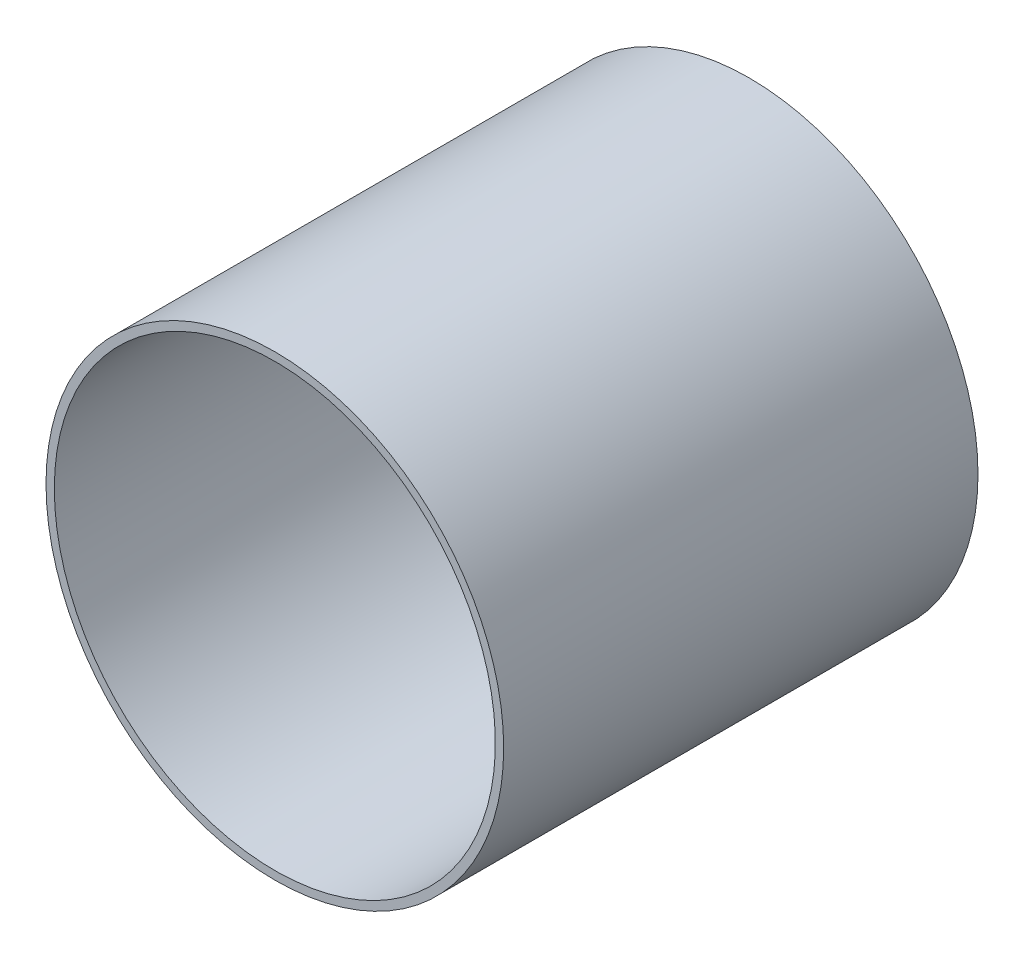
ISO-10303-21;
HEADER;
FILE_DESCRIPTION(('STEP AP214'),'2;1');
FILE_NAME('part.step','',(''),(''),'','','');
FILE_SCHEMA(('AUTOMOTIVE_DESIGN { 1 0 10303 214 1 1 1 1 }'));
ENDSEC;
DATA;
#1=APPLICATION_CONTEXT('core data for automotive mechanical design processes');
#2=APPLICATION_PROTOCOL_DEFINITION('international standard','automotive_design',2000,#1);
#3=PRODUCT_CONTEXT('',#1,'mechanical');
#4=PRODUCT('Part','Part','',(#3));
#5=PRODUCT_RELATED_PRODUCT_CATEGORY('part','',(#4));
#6=PRODUCT_DEFINITION_FORMATION('','',#4);
#7=PRODUCT_DEFINITION_CONTEXT('part definition',#1,'design');
#8=PRODUCT_DEFINITION('design','',#6,#7);
#9=PRODUCT_DEFINITION_SHAPE('','',#8);
#10=(LENGTH_UNIT() NAMED_UNIT(*) SI_UNIT(.MILLI.,.METRE.));
#11=(NAMED_UNIT(*) PLANE_ANGLE_UNIT() SI_UNIT($,.RADIAN.));
#12=(NAMED_UNIT(*) SI_UNIT($,.STERADIAN.) SOLID_ANGLE_UNIT());
#13=UNCERTAINTY_MEASURE_WITH_UNIT(LENGTH_MEASURE(1.E-05),#10,'distance_accuracy_value','');
#14=(GEOMETRIC_REPRESENTATION_CONTEXT(3) GLOBAL_UNCERTAINTY_ASSIGNED_CONTEXT((#13)) GLOBAL_UNIT_ASSIGNED_CONTEXT((#10,
#11,#12)) REPRESENTATION_CONTEXT('',''));
#15=CARTESIAN_POINT('',(0.,0.,0.));
#16=DIRECTION('',(0.,0.,1.));
#17=DIRECTION('',(1.,0.,0.));
#18=AXIS2_PLACEMENT_3D('',#15,#16,#17);
#19=CARTESIAN_POINT('',(0.,0.,57.));
#20=DIRECTION('',(0.,0.,1.));
#21=DIRECTION('',(1.,0.,0.));
#22=AXIS2_PLACEMENT_3D('',#19,#20,#21);
#23=PLANE('',#22);
#24=CARTESIAN_POINT('',(0.,0.,57.));
#25=DIRECTION('',(0.,0.,1.));
#26=DIRECTION('',(1.,0.,0.));
#27=AXIS2_PLACEMENT_3D('',#24,#25,#26);
#28=CIRCLE('',#27,27.5);
#29=CARTESIAN_POINT('',(-27.5,0.,57.));
#30=VERTEX_POINT('',#29);
#31=EDGE_CURVE('E10',#30,#30,#28,.T.);
#32=ORIENTED_EDGE('',*,*,#31,.T.);
#33=EDGE_LOOP('',(#32));
#34=FACE_BOUND('',#33,.T.);
#35=CARTESIAN_POINT('',(0.,0.,57.));
#36=DIRECTION('',(0.,0.,1.));
#37=DIRECTION('',(1.,0.,0.));
#38=AXIS2_PLACEMENT_3D('',#35,#36,#37);
#39=CIRCLE('',#38,26.5);
#40=CARTESIAN_POINT('',(-26.5,0.,57.));
#41=VERTEX_POINT('',#40);
#42=EDGE_CURVE('E359',#41,#41,#39,.T.);
#43=ORIENTED_EDGE('',*,*,#42,.F.);
#44=EDGE_LOOP('',(#43));
#45=FACE_BOUND('',#44,.T.);
#46=ADVANCED_FACE('F348',(#34,#45),#23,.T.);
#47=CARTESIAN_POINT('',(0.,0.,0.));
#48=DIRECTION('',(0.,0.,1.));
#49=DIRECTION('',(1.,0.,0.));
#50=AXIS2_PLACEMENT_3D('',#47,#48,#49);
#51=PLANE('',#50);
#52=CARTESIAN_POINT('',(0.,0.,0.));
#53=DIRECTION('',(0.,0.,1.));
#54=DIRECTION('',(1.,0.,0.));
#55=AXIS2_PLACEMENT_3D('',#52,#53,#54);
#56=CIRCLE('',#55,27.5);
#57=CARTESIAN_POINT('',(-27.5,0.,0.));
#58=VERTEX_POINT('',#57);
#59=EDGE_CURVE('E355',#58,#58,#56,.T.);
#60=ORIENTED_EDGE('',*,*,#59,.F.);
#61=EDGE_LOOP('',(#60));
#62=FACE_BOUND('',#61,.T.);
#63=CARTESIAN_POINT('',(0.,0.,0.));
#64=DIRECTION('',(0.,0.,1.));
#65=DIRECTION('',(1.,0.,0.));
#66=AXIS2_PLACEMENT_3D('',#63,#64,#65);
#67=CIRCLE('',#66,26.5);
#68=CARTESIAN_POINT('',(-26.5,0.,0.));
#69=VERTEX_POINT('',#68);
#70=EDGE_CURVE('E363',#69,#69,#67,.T.);
#71=ORIENTED_EDGE('',*,*,#70,.T.);
#72=EDGE_LOOP('',(#71));
#73=FACE_BOUND('',#72,.T.);
#74=ADVANCED_FACE('F369',(#62,#73),#51,.F.);
#75=CARTESIAN_POINT('',(0.,0.,57.));
#76=DIRECTION('',(0.,0.,-1.));
#77=DIRECTION('',(-1.,0.,0.));
#78=AXIS2_PLACEMENT_3D('',#75,#76,#77);
#79=CYLINDRICAL_SURFACE('',#78,27.5);
#80=CARTESIAN_POINT('',(-27.5,0.,57.));
#81=CARTESIAN_POINT('',(-27.5,0.,56.40625));
#82=CARTESIAN_POINT('',(-27.5,0.,55.8125));
#83=CARTESIAN_POINT('',(-27.5,0.,54.625));
#84=CARTESIAN_POINT('',(-27.5,0.,54.03125));
#85=CARTESIAN_POINT('',(-27.5,0.,52.84375));
#86=CARTESIAN_POINT('',(-27.5,0.,52.25));
#87=CARTESIAN_POINT('',(-27.5,0.,51.0625));
#88=CARTESIAN_POINT('',(-27.5,0.,50.46875));
#89=CARTESIAN_POINT('',(-27.5,0.,49.28125));
#90=CARTESIAN_POINT('',(-27.5,0.,48.6875));
#91=CARTESIAN_POINT('',(-27.5,0.,47.5));
#92=CARTESIAN_POINT('',(-27.5,0.,46.90625));
#93=CARTESIAN_POINT('',(-27.5,0.,45.71875));
#94=CARTESIAN_POINT('',(-27.5,0.,45.125));
#95=CARTESIAN_POINT('',(-27.5,0.,43.9375));
#96=CARTESIAN_POINT('',(-27.5,0.,43.34375));
#97=CARTESIAN_POINT('',(-27.5,0.,42.15625));
#98=CARTESIAN_POINT('',(-27.5,0.,41.5625));
#99=CARTESIAN_POINT('',(-27.5,0.,40.375));
#100=CARTESIAN_POINT('',(-27.5,0.,39.78125));
#101=CARTESIAN_POINT('',(-27.5,0.,38.59375));
#102=CARTESIAN_POINT('',(-27.5,0.,38.));
#103=CARTESIAN_POINT('',(-27.5,0.,36.8125));
#104=CARTESIAN_POINT('',(-27.5,0.,36.21875));
#105=CARTESIAN_POINT('',(-27.5,0.,35.03125));
#106=CARTESIAN_POINT('',(-27.5,0.,34.4375));
#107=CARTESIAN_POINT('',(-27.5,0.,33.25));
#108=CARTESIAN_POINT('',(-27.5,0.,32.65625));
#109=CARTESIAN_POINT('',(-27.5,0.,31.46875));
#110=CARTESIAN_POINT('',(-27.5,0.,30.875));
#111=CARTESIAN_POINT('',(-27.5,0.,29.6875));
#112=CARTESIAN_POINT('',(-27.5,0.,29.09375));
#113=CARTESIAN_POINT('',(-27.5,0.,27.90625));
#114=CARTESIAN_POINT('',(-27.5,0.,27.3125));
#115=CARTESIAN_POINT('',(-27.5,0.,26.125));
#116=CARTESIAN_POINT('',(-27.5,0.,25.53125));
#117=CARTESIAN_POINT('',(-27.5,0.,24.34375));
#118=CARTESIAN_POINT('',(-27.5,0.,23.75));
#119=CARTESIAN_POINT('',(-27.5,0.,22.5625));
#120=CARTESIAN_POINT('',(-27.5,0.,21.96875));
#121=CARTESIAN_POINT('',(-27.5,0.,20.78125));
#122=CARTESIAN_POINT('',(-27.5,0.,20.1875));
#123=CARTESIAN_POINT('',(-27.5,0.,19.));
#124=CARTESIAN_POINT('',(-27.5,0.,18.40625));
#125=CARTESIAN_POINT('',(-27.5,0.,17.21875));
#126=CARTESIAN_POINT('',(-27.5,0.,16.625));
#127=CARTESIAN_POINT('',(-27.5,0.,15.4375));
#128=CARTESIAN_POINT('',(-27.5,0.,14.84375));
#129=CARTESIAN_POINT('',(-27.5,0.,13.65625));
#130=CARTESIAN_POINT('',(-27.5,0.,13.0625));
#131=CARTESIAN_POINT('',(-27.5,0.,11.875));
#132=CARTESIAN_POINT('',(-27.5,0.,11.28125));
#133=CARTESIAN_POINT('',(-27.5,0.,10.09375));
#134=CARTESIAN_POINT('',(-27.5,0.,9.5));
#135=CARTESIAN_POINT('',(-27.5,0.,8.3125));
#136=CARTESIAN_POINT('',(-27.5,0.,7.71875));
#137=CARTESIAN_POINT('',(-27.5,0.,6.53125));
#138=CARTESIAN_POINT('',(-27.5,0.,5.9375));
#139=CARTESIAN_POINT('',(-27.5,0.,4.75));
#140=CARTESIAN_POINT('',(-27.5,0.,4.15625));
#141=CARTESIAN_POINT('',(-27.5,0.,2.96875));
#142=CARTESIAN_POINT('',(-27.5,0.,2.375));
#143=CARTESIAN_POINT('',(-27.5,0.,1.1875));
#144=CARTESIAN_POINT('',(-27.5,0.,0.593749999999999));
#145=CARTESIAN_POINT('',(-27.5,0.,0.));
#146=B_SPLINE_CURVE_WITH_KNOTS('',3,(#80,#81,#82,#83,#84,#85,#86,#87,#88,#89,#90,#91,#92,#93,
#94,#95,#96,#97,#98,#99,#100,#101,#102,#103,#104,#105,#106,#107,#108,#109,#110,#111,#112,#113,
#114,#115,#116,#117,#118,#119,#120,#121,#122,#123,#124,#125,#126,#127,#128,#129,#130,#131,#132,
#133,#134,#135,#136,#137,#138,#139,#140,#141,#142,#143,#144,#145),.UNSPECIFIED.,.F.,.F.,(4,2,2,
2,2,2,2,2,2,2,2,2,2,2,2,2,2,2,2,2,2,2,2,2,2,2,2,2,2,2,2,2,4),(0.,1.78125,3.5625,
5.34374999999999,7.12499999999999,8.90625,10.6875,12.46875,14.25,16.03125,17.8125,19.59375,
21.375,23.15625,24.9375,26.71875,28.5,30.28125,32.0625,33.84375,35.625,37.40625,39.1875,
40.96875,42.75,44.53125,46.3125,48.09375,49.875,51.65625,53.4375,55.21875,57.),.UNSPECIFIED.);
#147=EDGE_CURVE('BSEAM350',#30,#58,#146,.T.);
#148=ORIENTED_EDGE('',*,*,#31,.F.);
#149=ORIENTED_EDGE('',*,*,#59,.T.);
#150=ORIENTED_EDGE('',*,*,#147,.T.);
#151=ORIENTED_EDGE('',*,*,#147,.F.);
#152=EDGE_LOOP('',(#148,#150,#149,#151));
#153=FACE_BOUND('',#152,.T.);
#154=ADVANCED_FACE('F350',(#153),#79,.T.);
#155=CARTESIAN_POINT('',(0.,0.,57.));
#156=DIRECTION('',(0.,0.,-1.));
#157=DIRECTION('',(-1.,0.,0.));
#158=AXIS2_PLACEMENT_3D('',#155,#156,#157);
#159=CYLINDRICAL_SURFACE('',#158,26.5);
#160=CARTESIAN_POINT('',(-26.5,0.,57.));
#161=CARTESIAN_POINT('',(-26.5,0.,56.40625));
#162=CARTESIAN_POINT('',(-26.5,0.,55.8125));
#163=CARTESIAN_POINT('',(-26.5,0.,54.625));
#164=CARTESIAN_POINT('',(-26.5,0.,54.03125));
#165=CARTESIAN_POINT('',(-26.5,0.,52.84375));
#166=CARTESIAN_POINT('',(-26.5,0.,52.25));
#167=CARTESIAN_POINT('',(-26.5,0.,51.0625));
#168=CARTESIAN_POINT('',(-26.5,0.,50.46875));
#169=CARTESIAN_POINT('',(-26.5,0.,49.28125));
#170=CARTESIAN_POINT('',(-26.5,0.,48.6875));
#171=CARTESIAN_POINT('',(-26.5,0.,47.5));
#172=CARTESIAN_POINT('',(-26.5,0.,46.90625));
#173=CARTESIAN_POINT('',(-26.5,0.,45.71875));
#174=CARTESIAN_POINT('',(-26.5,0.,45.125));
#175=CARTESIAN_POINT('',(-26.5,0.,43.9375));
#176=CARTESIAN_POINT('',(-26.5,0.,43.34375));
#177=CARTESIAN_POINT('',(-26.5,0.,42.15625));
#178=CARTESIAN_POINT('',(-26.5,0.,41.5625));
#179=CARTESIAN_POINT('',(-26.5,0.,40.375));
#180=CARTESIAN_POINT('',(-26.5,0.,39.78125));
#181=CARTESIAN_POINT('',(-26.5,0.,38.59375));
#182=CARTESIAN_POINT('',(-26.5,0.,38.));
#183=CARTESIAN_POINT('',(-26.5,0.,36.8125));
#184=CARTESIAN_POINT('',(-26.5,0.,36.21875));
#185=CARTESIAN_POINT('',(-26.5,0.,35.03125));
#186=CARTESIAN_POINT('',(-26.5,0.,34.4375));
#187=CARTESIAN_POINT('',(-26.5,0.,33.25));
#188=CARTESIAN_POINT('',(-26.5,0.,32.65625));
#189=CARTESIAN_POINT('',(-26.5,0.,31.46875));
#190=CARTESIAN_POINT('',(-26.5,0.,30.875));
#191=CARTESIAN_POINT('',(-26.5,0.,29.6875));
#192=CARTESIAN_POINT('',(-26.5,0.,29.09375));
#193=CARTESIAN_POINT('',(-26.5,0.,27.90625));
#194=CARTESIAN_POINT('',(-26.5,0.,27.3125));
#195=CARTESIAN_POINT('',(-26.5,0.,26.125));
#196=CARTESIAN_POINT('',(-26.5,0.,25.53125));
#197=CARTESIAN_POINT('',(-26.5,0.,24.34375));
#198=CARTESIAN_POINT('',(-26.5,0.,23.75));
#199=CARTESIAN_POINT('',(-26.5,0.,22.5625));
#200=CARTESIAN_POINT('',(-26.5,0.,21.96875));
#201=CARTESIAN_POINT('',(-26.5,0.,20.78125));
#202=CARTESIAN_POINT('',(-26.5,0.,20.1875));
#203=CARTESIAN_POINT('',(-26.5,0.,19.));
#204=CARTESIAN_POINT('',(-26.5,0.,18.40625));
#205=CARTESIAN_POINT('',(-26.5,0.,17.21875));
#206=CARTESIAN_POINT('',(-26.5,0.,16.625));
#207=CARTESIAN_POINT('',(-26.5,0.,15.4375));
#208=CARTESIAN_POINT('',(-26.5,0.,14.84375));
#209=CARTESIAN_POINT('',(-26.5,0.,13.65625));
#210=CARTESIAN_POINT('',(-26.5,0.,13.0625));
#211=CARTESIAN_POINT('',(-26.5,0.,11.875));
#212=CARTESIAN_POINT('',(-26.5,0.,11.28125));
#213=CARTESIAN_POINT('',(-26.5,0.,10.09375));
#214=CARTESIAN_POINT('',(-26.5,0.,9.5));
#215=CARTESIAN_POINT('',(-26.5,0.,8.3125));
#216=CARTESIAN_POINT('',(-26.5,0.,7.71875));
#217=CARTESIAN_POINT('',(-26.5,0.,6.53125));
#218=CARTESIAN_POINT('',(-26.5,0.,5.9375));
#219=CARTESIAN_POINT('',(-26.5,0.,4.75));
#220=CARTESIAN_POINT('',(-26.5,0.,4.15625));
#221=CARTESIAN_POINT('',(-26.5,0.,2.96875));
#222=CARTESIAN_POINT('',(-26.5,0.,2.375));
#223=CARTESIAN_POINT('',(-26.5,0.,1.1875));
#224=CARTESIAN_POINT('',(-26.5,0.,0.593749999999999));
#225=CARTESIAN_POINT('',(-26.5,0.,0.));
#226=B_SPLINE_CURVE_WITH_KNOTS('',3,(#160,#161,#162,#163,#164,#165,#166,#167,#168,#169,#170,
#171,#172,#173,#174,#175,#176,#177,#178,#179,#180,#181,#182,#183,#184,#185,#186,#187,#188,#189,
#190,#191,#192,#193,#194,#195,#196,#197,#198,#199,#200,#201,#202,#203,#204,#205,#206,#207,#208,
#209,#210,#211,#212,#213,#214,#215,#216,#217,#218,#219,#220,#221,#222,#223,#224,#225),
.UNSPECIFIED.,.F.,.F.,(4,2,2,2,2,2,2,2,2,2,2,2,2,2,2,2,2,2,2,2,2,2,2,2,2,2,2,2,2,2,2,2,4),(0.,
1.78125000000001,3.5625,5.34375,7.12500000000001,8.90625,10.6875,12.46875,14.25,16.03125,
17.8125,19.59375,21.375,23.15625,24.9375,26.71875,28.5,30.28125,32.0625,33.84375,35.625,
37.40625,39.1875,40.96875,42.75,44.53125,46.3125,48.09375,49.875,51.65625,53.4375,55.21875,57.),.UNSPECIFIED.);
#227=EDGE_CURVE('BSEAM371',#41,#69,#226,.T.);
#228=ORIENTED_EDGE('',*,*,#42,.T.);
#229=ORIENTED_EDGE('',*,*,#70,.F.);
#230=ORIENTED_EDGE('',*,*,#227,.T.);
#231=ORIENTED_EDGE('',*,*,#227,.F.);
#232=EDGE_LOOP('',(#228,#230,#229,#231));
#233=FACE_BOUND('',#232,.T.);
#234=ADVANCED_FACE('F371',(#233),#159,.F.);
#235=CLOSED_SHELL('',(#46,#74,#154,#234));
#236=MANIFOLD_SOLID_BREP('B2',#235);
#237=ADVANCED_BREP_SHAPE_REPRESENTATION('',(#18,#236),#14);
#238=SHAPE_DEFINITION_REPRESENTATION(#9,#237);
ENDSEC;
END-ISO-10303-21;
